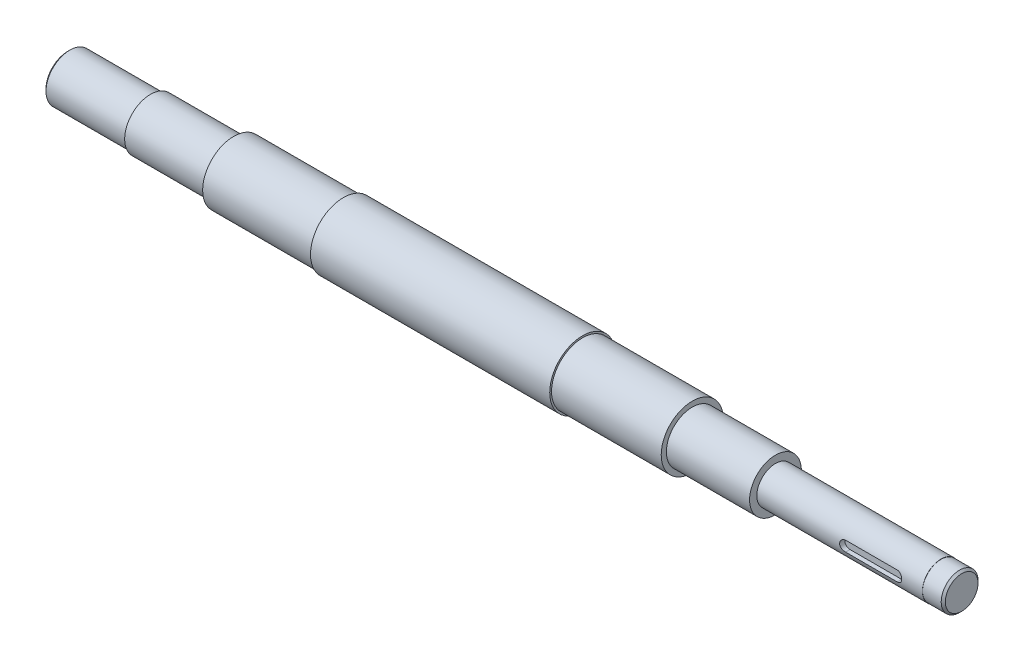
ISO-10303-21;
HEADER;
FILE_DESCRIPTION(('STEP AP214'),'2;1');
FILE_NAME('part.step','',(''),(''),'','','');
FILE_SCHEMA(('AUTOMOTIVE_DESIGN { 1 0 10303 214 1 1 1 1 }'));
ENDSEC;
DATA;
#1=APPLICATION_CONTEXT('core data for automotive mechanical design processes');
#2=APPLICATION_PROTOCOL_DEFINITION('international standard','automotive_design',2000,#1);
#3=PRODUCT_CONTEXT('',#1,'mechanical');
#4=PRODUCT('Part','Part','',(#3));
#5=PRODUCT_RELATED_PRODUCT_CATEGORY('part','',(#4));
#6=PRODUCT_DEFINITION_FORMATION('','',#4);
#7=PRODUCT_DEFINITION_CONTEXT('part definition',#1,'design');
#8=PRODUCT_DEFINITION('design','',#6,#7);
#9=PRODUCT_DEFINITION_SHAPE('','',#8);
#10=(LENGTH_UNIT() NAMED_UNIT(*) SI_UNIT(.MILLI.,.METRE.));
#11=(NAMED_UNIT(*) PLANE_ANGLE_UNIT() SI_UNIT($,.RADIAN.));
#12=(NAMED_UNIT(*) SI_UNIT($,.STERADIAN.) SOLID_ANGLE_UNIT());
#13=UNCERTAINTY_MEASURE_WITH_UNIT(LENGTH_MEASURE(1.E-05),#10,'distance_accuracy_value','');
#14=(GEOMETRIC_REPRESENTATION_CONTEXT(3) GLOBAL_UNCERTAINTY_ASSIGNED_CONTEXT((#13)) GLOBAL_UNIT_ASSIGNED_CONTEXT((#10,
#11,#12)) REPRESENTATION_CONTEXT('',''));
#15=CARTESIAN_POINT('',(0.,0.,0.));
#16=DIRECTION('',(0.,0.,1.));
#17=DIRECTION('',(1.,0.,0.));
#18=AXIS2_PLACEMENT_3D('',#15,#16,#17);
#19=CARTESIAN_POINT('',(110.8,15.,0.));
#20=DIRECTION('',(-1.,0.,0.));
#21=DIRECTION('',(0.,0.,1.));
#22=AXIS2_PLACEMENT_3D('',#19,#20,#21);
#23=PLANE('',#22);
#24=CARTESIAN_POINT('',(110.8,0.,0.));
#25=DIRECTION('',(-1.,0.,0.));
#26=DIRECTION('',(0.,0.,1.));
#27=AXIS2_PLACEMENT_3D('',#24,#25,#26);
#28=CIRCLE('',#27,15.);
#29=CARTESIAN_POINT('',(110.8,0.,15.));
#30=VERTEX_POINT('',#29);
#31=EDGE_CURVE('E158',#30,#30,#28,.T.);
#32=ORIENTED_EDGE('',*,*,#31,.F.);
#33=EDGE_LOOP('',(#32));
#34=FACE_BOUND('',#33,.T.);
#35=CARTESIAN_POINT('',(110.8,0.,0.));
#36=DIRECTION('',(-1.,0.,0.));
#37=DIRECTION('',(0.,0.,1.));
#38=AXIS2_PLACEMENT_3D('',#35,#36,#37);
#39=CIRCLE('',#38,12.5);
#40=CARTESIAN_POINT('',(110.8,0.,12.5));
#41=VERTEX_POINT('',#40);
#42=EDGE_CURVE('E104',#41,#41,#39,.T.);
#43=ORIENTED_EDGE('',*,*,#42,.T.);
#44=EDGE_LOOP('',(#43));
#45=FACE_BOUND('',#44,.T.);
#46=ADVANCED_FACE('F39',(#34,#45),#23,.F.);
#47=CARTESIAN_POINT('',(0.,0.,0.));
#48=DIRECTION('',(-1.,0.,0.));
#49=DIRECTION('',(0.,0.,1.));
#50=AXIS2_PLACEMENT_3D('',#47,#48,#49);
#51=CYLINDRICAL_SURFACE('',#50,15.);
#52=CARTESIAN_POINT('',(57.8,0.,0.));
#53=DIRECTION('',(-1.,0.,0.));
#54=DIRECTION('',(0.,0.,1.));
#55=AXIS2_PLACEMENT_3D('',#52,#53,#54);
#56=CIRCLE('',#55,15.);
#57=CARTESIAN_POINT('',(57.8,0.,15.));
#58=VERTEX_POINT('',#57);
#59=EDGE_CURVE('E155',#58,#58,#56,.T.);
#60=ORIENTED_EDGE('',*,*,#59,.F.);
#61=EDGE_LOOP('',(#60));
#62=FACE_BOUND('',#61,.T.);
#63=ORIENTED_EDGE('',*,*,#31,.T.);
#64=EDGE_LOOP('',(#63));
#65=FACE_BOUND('',#64,.T.);
#66=ADVANCED_FACE('F206',(#62,#65),#51,.T.);
#67=CARTESIAN_POINT('',(57.8,15.875,0.));
#68=DIRECTION('',(-1.,0.,0.));
#69=DIRECTION('',(0.,0.,1.));
#70=AXIS2_PLACEMENT_3D('',#67,#68,#69);
#71=PLANE('',#70);
#72=CARTESIAN_POINT('',(57.8,0.,0.));
#73=DIRECTION('',(-1.,0.,0.));
#74=DIRECTION('',(0.,0.,1.));
#75=AXIS2_PLACEMENT_3D('',#72,#73,#74);
#76=CIRCLE('',#75,15.875);
#77=CARTESIAN_POINT('',(57.8,0.,15.875));
#78=VERTEX_POINT('',#77);
#79=EDGE_CURVE('E152',#78,#78,#76,.T.);
#80=ORIENTED_EDGE('',*,*,#79,.F.);
#81=EDGE_LOOP('',(#80));
#82=FACE_BOUND('',#81,.T.);
#83=ORIENTED_EDGE('',*,*,#59,.T.);
#84=EDGE_LOOP('',(#83));
#85=FACE_BOUND('',#84,.T.);
#86=ADVANCED_FACE('F211',(#82,#85),#71,.F.);
#87=CARTESIAN_POINT('',(0.,0.,0.));
#88=DIRECTION('',(-1.,0.,0.));
#89=DIRECTION('',(0.,0.,1.));
#90=AXIS2_PLACEMENT_3D('',#87,#88,#89);
#91=CYLINDRICAL_SURFACE('',#90,15.875);
#92=CARTESIAN_POINT('',(-57.8,0.,0.));
#93=DIRECTION('',(-1.,0.,0.));
#94=DIRECTION('',(0.,0.,1.));
#95=AXIS2_PLACEMENT_3D('',#92,#93,#94);
#96=CIRCLE('',#95,15.875);
#97=CARTESIAN_POINT('',(-57.8,0.,15.875));
#98=VERTEX_POINT('',#97);
#99=EDGE_CURVE('E149',#98,#98,#96,.T.);
#100=ORIENTED_EDGE('',*,*,#99,.F.);
#101=EDGE_LOOP('',(#100));
#102=FACE_BOUND('',#101,.T.);
#103=ORIENTED_EDGE('',*,*,#79,.T.);
#104=EDGE_LOOP('',(#103));
#105=FACE_BOUND('',#104,.T.);
#106=ADVANCED_FACE('F221',(#102,#105),#91,.T.);
#107=CARTESIAN_POINT('',(-57.8,15.875,0.));
#108=DIRECTION('',(1.,0.,0.));
#109=DIRECTION('',(0.,0.,-1.));
#110=AXIS2_PLACEMENT_3D('',#107,#108,#109);
#111=PLANE('',#110);
#112=CARTESIAN_POINT('',(-57.8,0.,0.));
#113=DIRECTION('',(-1.,0.,0.));
#114=DIRECTION('',(0.,0.,1.));
#115=AXIS2_PLACEMENT_3D('',#112,#113,#114);
#116=CIRCLE('',#115,15.);
#117=CARTESIAN_POINT('',(-57.8,0.,15.));
#118=VERTEX_POINT('',#117);
#119=EDGE_CURVE('E146',#118,#118,#116,.T.);
#120=ORIENTED_EDGE('',*,*,#119,.F.);
#121=EDGE_LOOP('',(#120));
#122=FACE_BOUND('',#121,.T.);
#123=ORIENTED_EDGE('',*,*,#99,.T.);
#124=EDGE_LOOP('',(#123));
#125=FACE_BOUND('',#124,.T.);
#126=ADVANCED_FACE('F228',(#122,#125),#111,.F.);
#127=CARTESIAN_POINT('',(0.,0.,0.));
#128=DIRECTION('',(-1.,0.,0.));
#129=DIRECTION('',(0.,0.,1.));
#130=AXIS2_PLACEMENT_3D('',#127,#128,#129);
#131=CYLINDRICAL_SURFACE('',#130,15.);
#132=CARTESIAN_POINT('',(-110.8,0.,0.));
#133=DIRECTION('',(-1.,0.,0.));
#134=DIRECTION('',(0.,0.,1.));
#135=AXIS2_PLACEMENT_3D('',#132,#133,#134);
#136=CIRCLE('',#135,15.);
#137=CARTESIAN_POINT('',(-110.8,0.,15.));
#138=VERTEX_POINT('',#137);
#139=EDGE_CURVE('E143',#138,#138,#136,.T.);
#140=ORIENTED_EDGE('',*,*,#139,.F.);
#141=EDGE_LOOP('',(#140));
#142=FACE_BOUND('',#141,.T.);
#143=ORIENTED_EDGE('',*,*,#119,.T.);
#144=EDGE_LOOP('',(#143));
#145=FACE_BOUND('',#144,.T.);
#146=ADVANCED_FACE('F232',(#142,#145),#131,.T.);
#147=CARTESIAN_POINT('',(-110.8,15.,0.));
#148=DIRECTION('',(1.,0.,0.));
#149=DIRECTION('',(0.,0.,-1.));
#150=AXIS2_PLACEMENT_3D('',#147,#148,#149);
#151=PLANE('',#150);
#152=CARTESIAN_POINT('',(-110.8,0.,0.));
#153=DIRECTION('',(-1.,0.,0.));
#154=DIRECTION('',(0.,0.,1.));
#155=AXIS2_PLACEMENT_3D('',#152,#153,#154);
#156=CIRCLE('',#155,12.5);
#157=CARTESIAN_POINT('',(-110.8,0.,12.5));
#158=VERTEX_POINT('',#157);
#159=EDGE_CURVE('E140',#158,#158,#156,.T.);
#160=ORIENTED_EDGE('',*,*,#159,.F.);
#161=EDGE_LOOP('',(#160));
#162=FACE_BOUND('',#161,.T.);
#163=ORIENTED_EDGE('',*,*,#139,.T.);
#164=EDGE_LOOP('',(#163));
#165=FACE_BOUND('',#164,.T.);
#166=ADVANCED_FACE('F236',(#162,#165),#151,.F.);
#167=CARTESIAN_POINT('',(0.,0.,0.));
#168=DIRECTION('',(-1.,0.,0.));
#169=DIRECTION('',(0.,0.,1.));
#170=AXIS2_PLACEMENT_3D('',#167,#168,#169);
#171=CYLINDRICAL_SURFACE('',#170,12.5);
#172=CARTESIAN_POINT('',(-151.,0.,0.));
#173=DIRECTION('',(-1.,0.,0.));
#174=DIRECTION('',(0.,0.,1.));
#175=AXIS2_PLACEMENT_3D('',#172,#173,#174);
#176=CIRCLE('',#175,12.5);
#177=CARTESIAN_POINT('',(-151.,0.,12.5));
#178=VERTEX_POINT('',#177);
#179=EDGE_CURVE('E137',#178,#178,#176,.T.);
#180=ORIENTED_EDGE('',*,*,#179,.F.);
#181=EDGE_LOOP('',(#180));
#182=FACE_BOUND('',#181,.T.);
#183=ORIENTED_EDGE('',*,*,#159,.T.);
#184=EDGE_LOOP('',(#183));
#185=FACE_BOUND('',#184,.T.);
#186=ADVANCED_FACE('F240',(#182,#185),#171,.T.);
#187=CARTESIAN_POINT('',(-151.,12.5,0.));
#188=DIRECTION('',(1.,0.,0.));
#189=DIRECTION('',(0.,0.,-1.));
#190=AXIS2_PLACEMENT_3D('',#187,#188,#189);
#191=PLANE('',#190);
#192=CARTESIAN_POINT('',(-151.,0.,0.));
#193=DIRECTION('',(-1.,0.,0.));
#194=DIRECTION('',(0.,0.,1.));
#195=AXIS2_PLACEMENT_3D('',#192,#193,#194);
#196=CIRCLE('',#195,11.5);
#197=CARTESIAN_POINT('',(-151.,0.,11.5));
#198=VERTEX_POINT('',#197);
#199=EDGE_CURVE('E134',#198,#198,#196,.T.);
#200=ORIENTED_EDGE('',*,*,#199,.F.);
#201=EDGE_LOOP('',(#200));
#202=FACE_BOUND('',#201,.T.);
#203=ORIENTED_EDGE('',*,*,#179,.T.);
#204=EDGE_LOOP('',(#203));
#205=FACE_BOUND('',#204,.T.);
#206=ADVANCED_FACE('F244',(#202,#205),#191,.F.);
#207=CARTESIAN_POINT('',(0.,0.,0.));
#208=DIRECTION('',(-1.,0.,0.));
#209=DIRECTION('',(0.,0.,1.));
#210=AXIS2_PLACEMENT_3D('',#207,#208,#209);
#211=CYLINDRICAL_SURFACE('',#210,11.5);
#212=CARTESIAN_POINT('',(-190.,0.,0.));
#213=DIRECTION('',(-1.,0.,0.));
#214=DIRECTION('',(0.,0.,1.));
#215=AXIS2_PLACEMENT_3D('',#212,#213,#214);
#216=CIRCLE('',#215,11.5);
#217=CARTESIAN_POINT('',(-190.,0.,11.5));
#218=VERTEX_POINT('',#217);
#219=EDGE_CURVE('E131',#218,#218,#216,.T.);
#220=ORIENTED_EDGE('',*,*,#219,.F.);
#221=EDGE_LOOP('',(#220));
#222=FACE_BOUND('',#221,.T.);
#223=ORIENTED_EDGE('',*,*,#199,.T.);
#224=EDGE_LOOP('',(#223));
#225=FACE_BOUND('',#224,.T.);
#226=ADVANCED_FACE('F248',(#222,#225),#211,.T.);
#227=CARTESIAN_POINT('',(-190.,0.,0.));
#228=DIRECTION('',(1.,0.,0.));
#229=DIRECTION('',(0.,0.,-1.));
#230=AXIS2_PLACEMENT_3D('',#227,#228,#229);
#231=CONICAL_SURFACE('',#230,11.5,0.785398163397448);
#232=CARTESIAN_POINT('',(-191.,0.,0.));
#233=DIRECTION('',(-1.,0.,0.));
#234=DIRECTION('',(0.,0.,1.));
#235=AXIS2_PLACEMENT_3D('',#232,#233,#234);
#236=CIRCLE('',#235,10.5);
#237=CARTESIAN_POINT('',(-191.,0.,10.5));
#238=VERTEX_POINT('',#237);
#239=EDGE_CURVE('E128',#238,#238,#236,.T.);
#240=ORIENTED_EDGE('',*,*,#239,.F.);
#241=EDGE_LOOP('',(#240));
#242=FACE_BOUND('',#241,.T.);
#243=ORIENTED_EDGE('',*,*,#219,.T.);
#244=EDGE_LOOP('',(#243));
#245=FACE_BOUND('',#244,.T.);
#246=ADVANCED_FACE('F252',(#242,#245),#231,.T.);
#247=CARTESIAN_POINT('',(-191.,10.5,0.));
#248=DIRECTION('',(1.,0.,0.));
#249=DIRECTION('',(0.,0.,-1.));
#250=AXIS2_PLACEMENT_3D('',#247,#248,#249);
#251=PLANE('',#250);
#252=ORIENTED_EDGE('',*,*,#239,.T.);
#253=EDGE_LOOP('',(#252));
#254=FACE_BOUND('',#253,.T.);
#255=ADVANCED_FACE('F256',(#254),#251,.F.);
#256=CARTESIAN_POINT('',(241.,7.9,0.));
#257=DIRECTION('',(-1.,0.,0.));
#258=DIRECTION('',(0.,0.,1.));
#259=AXIS2_PLACEMENT_3D('',#256,#257,#258);
#260=PLANE('',#259);
#261=CARTESIAN_POINT('',(241.,0.,0.));
#262=DIRECTION('',(-1.,0.,0.));
#263=DIRECTION('',(0.,0.,1.));
#264=AXIS2_PLACEMENT_3D('',#261,#262,#263);
#265=CIRCLE('',#264,7.9);
#266=CARTESIAN_POINT('',(241.,0.,7.9));
#267=VERTEX_POINT('',#266);
#268=EDGE_CURVE('E125',#267,#267,#265,.T.);
#269=ORIENTED_EDGE('',*,*,#268,.F.);
#270=EDGE_LOOP('',(#269));
#271=FACE_BOUND('',#270,.T.);
#272=ADVANCED_FACE('F260',(#271),#260,.F.);
#273=CARTESIAN_POINT('',(241.,0.,0.));
#274=DIRECTION('',(-1.,0.,0.));
#275=DIRECTION('',(0.,0.,1.));
#276=AXIS2_PLACEMENT_3D('',#273,#274,#275);
#277=CONICAL_SURFACE('',#276,7.9,0.785398163397461);
#278=CARTESIAN_POINT('',(240.,0.,0.));
#279=DIRECTION('',(-1.,0.,0.));
#280=DIRECTION('',(0.,0.,1.));
#281=AXIS2_PLACEMENT_3D('',#278,#279,#280);
#282=CIRCLE('',#281,8.9);
#283=CARTESIAN_POINT('',(240.,0.,8.9));
#284=VERTEX_POINT('',#283);
#285=EDGE_CURVE('E122',#284,#284,#282,.T.);
#286=ORIENTED_EDGE('',*,*,#285,.F.);
#287=EDGE_LOOP('',(#286));
#288=FACE_BOUND('',#287,.T.);
#289=ORIENTED_EDGE('',*,*,#268,.T.);
#290=EDGE_LOOP('',(#289));
#291=FACE_BOUND('',#290,.T.);
#292=ADVANCED_FACE('F264',(#288,#291),#277,.T.);
#293=CARTESIAN_POINT('',(0.,0.,0.));
#294=DIRECTION('',(-1.,0.,0.));
#295=DIRECTION('',(0.,0.,1.));
#296=AXIS2_PLACEMENT_3D('',#293,#294,#295);
#297=CYLINDRICAL_SURFACE('',#296,8.9);
#298=CARTESIAN_POINT('',(231.,0.,0.));
#299=DIRECTION('',(-1.,0.,0.));
#300=DIRECTION('',(0.,0.,1.));
#301=AXIS2_PLACEMENT_3D('',#298,#299,#300);
#302=CIRCLE('',#301,8.9);
#303=CARTESIAN_POINT('',(231.,0.,8.9));
#304=VERTEX_POINT('',#303);
#305=EDGE_CURVE('E119',#304,#304,#302,.T.);
#306=ORIENTED_EDGE('',*,*,#305,.F.);
#307=EDGE_LOOP('',(#306));
#308=FACE_BOUND('',#307,.T.);
#309=ORIENTED_EDGE('',*,*,#285,.T.);
#310=EDGE_LOOP('',(#309));
#311=FACE_BOUND('',#310,.T.);
#312=ADVANCED_FACE('F268',(#308,#311),#297,.T.);
#313=CARTESIAN_POINT('',(231.,9.,0.));
#314=DIRECTION('',(-1.,0.,0.));
#315=DIRECTION('',(0.,0.,1.));
#316=AXIS2_PLACEMENT_3D('',#313,#314,#315);
#317=PLANE('',#316);
#318=CARTESIAN_POINT('',(231.,0.,0.));
#319=DIRECTION('',(-1.,0.,0.));
#320=DIRECTION('',(0.,0.,1.));
#321=AXIS2_PLACEMENT_3D('',#318,#319,#320);
#322=CIRCLE('',#321,9.);
#323=CARTESIAN_POINT('',(231.,0.,9.));
#324=VERTEX_POINT('',#323);
#325=EDGE_CURVE('E116',#324,#324,#322,.T.);
#326=ORIENTED_EDGE('',*,*,#325,.F.);
#327=EDGE_LOOP('',(#326));
#328=FACE_BOUND('',#327,.T.);
#329=ORIENTED_EDGE('',*,*,#305,.T.);
#330=EDGE_LOOP('',(#329));
#331=FACE_BOUND('',#330,.T.);
#332=ADVANCED_FACE('F201',(#328,#331),#317,.F.);
#333=CARTESIAN_POINT('',(0.,0.,0.));
#334=DIRECTION('',(-1.,0.,0.));
#335=DIRECTION('',(0.,0.,1.));
#336=AXIS2_PLACEMENT_3D('',#333,#334,#335);
#337=CYLINDRICAL_SURFACE('',#336,9.);
#338=DIRECTION('',(-1.,0.,0.));
#339=VECTOR('',#338,1.);
#340=CARTESIAN_POINT('',(0.,2.5,8.64580823289529));
#341=LINE('',#340,#339);
#342=CARTESIAN_POINT('',(193.5,2.5,8.64580823289529));
#343=VERTEX_POINT('',#342);
#344=CARTESIAN_POINT('',(218.5,2.5,8.64580823289529));
#345=VERTEX_POINT('',#344);
#346=EDGE_CURVE('E11',#343,#345,#341,.F.);
#347=ORIENTED_EDGE('',*,*,#346,.T.);
#348=CARTESIAN_POINT('',(218.5,2.5,8.64580823289529));
#349=CARTESIAN_POINT('',(218.568858519984,2.50000830602292,8.64579950821757));
#350=CARTESIAN_POINT('',(218.637711900234,2.49715524603601,8.64663065807681));
#351=CARTESIAN_POINT('',(218.774898182384,2.48579096319931,8.64990792871954));
#352=CARTESIAN_POINT('',(218.84323118469,2.4772808613535,8.65235372954183));
#353=CARTESIAN_POINT('',(218.9787401302,2.45469269677159,8.6587882563543));
#354=CARTESIAN_POINT('',(219.045918348812,2.44062732375281,8.66277346547357));
#355=CARTESIAN_POINT('',(219.178784214456,2.40706322245486,8.67215936886944));
#356=CARTESIAN_POINT('',(219.244471831231,2.38756438399058,8.6775600918511));
#357=CARTESIAN_POINT('',(219.4385854376,2.3211450863276,8.69565518457923));
#358=CARTESIAN_POINT('',(219.564217461871,2.26627569938269,8.71025040337274));
#359=CARTESIAN_POINT('',(219.804480821549,2.13704900713882,8.7428505104496));
#360=CARTESIAN_POINT('',(219.919108023139,2.06268441755019,8.76085667251656));
#361=CARTESIAN_POINT('',(220.137253062746,1.89441897395303,8.79879412854936));
#362=CARTESIAN_POINT('',(220.240432067064,1.80008616533363,8.81876164554148));
#363=CARTESIAN_POINT('',(220.429727835009,1.59548835100875,8.85806142034494));
#364=CARTESIAN_POINT('',(220.515841795427,1.48522073288933,8.87739357335314));
#365=CARTESIAN_POINT('',(220.670005812165,1.24949780504097,8.91365243290547));
#366=CARTESIAN_POINT('',(220.737713578881,1.12381058827196,8.93053115307204));
#367=CARTESIAN_POINT('',(220.850901478086,0.862294107712359,8.95956074597986));
#368=CARTESIAN_POINT('',(220.896386705027,0.726467176659795,8.9717127021874));
#369=CARTESIAN_POINT('',(220.962730562329,0.45208782656323,8.98966308671867));
#370=CARTESIAN_POINT('',(220.984170575248,0.313685954719484,8.99561125337261));
#371=CARTESIAN_POINT('',(221.003647504672,0.0351274681096658,9.00100868484384));
#372=CARTESIAN_POINT('',(221.001688157166,-0.105028862966283,9.00045898712353));
#373=CARTESIAN_POINT('',(220.974824381365,-0.379054928934831,8.99303084531464));
#374=CARTESIAN_POINT('',(220.950548998979,-0.512991760209238,8.98632591253905));
#375=CARTESIAN_POINT('',(220.880762395271,-0.774808772562597,8.96754747987061));
#376=CARTESIAN_POINT('',(220.835250127526,-0.902688654850778,8.95547371543655));
#377=CARTESIAN_POINT('',(220.72381745397,-1.1503346990943,8.92706237810073));
#378=CARTESIAN_POINT('',(220.657687037923,-1.27000115579179,8.91068121327166));
#379=CARTESIAN_POINT('',(220.507058742606,-1.4967464992131,8.87541187730876));
#380=CARTESIAN_POINT('',(220.422557350944,-1.60382297278663,8.85652322703191));
#381=CARTESIAN_POINT('',(220.234281783126,-1.80609604775248,8.81753868463739));
#382=CARTESIAN_POINT('',(220.129961776031,-1.90078144217946,8.79742352895559));
#383=CARTESIAN_POINT('',(219.90669026155,-2.07146532777182,8.75880771863633));
#384=CARTESIAN_POINT('',(219.787734668071,-2.14745858245887,8.74030751735181));
#385=CARTESIAN_POINT('',(219.53736408609,-2.279043092931,8.70692961253113));
#386=CARTESIAN_POINT('',(219.405860159451,-2.33447263872621,8.69208091884035));
#387=CARTESIAN_POINT('',(219.134955984888,-2.42219486985499,8.66804909513355));
#388=CARTESIAN_POINT('',(218.995568001034,-2.45452247840333,8.65885741633596));
#389=CARTESIAN_POINT('',(218.795766236119,-2.48315519772344,8.65066448386834));
#390=CARTESIAN_POINT('',(218.73675823361,-2.4894721783985,8.64884681865799));
#391=CARTESIAN_POINT('',(218.618509832525,-2.49789031419067,8.64641887399253));
#392=CARTESIAN_POINT('',(218.559269937782,-2.49999800738002,8.6458067220955));
#393=CARTESIAN_POINT('',(218.5,-2.5,8.64580823289529));
#394=B_SPLINE_CURVE_WITH_KNOTS('',3,(#348,#349,#350,#351,#352,#353,#354,#355,#356,#357,#358,
#359,#360,#361,#362,#363,#364,#365,#366,#367,#368,#369,#370,#371,#372,#373,#374,#375,#376,#377,
#378,#379,#380,#381,#382,#383,#384,#385,#386,#387,#388,#389,#390,#391,#392,#393),.UNSPECIFIED.,
.F.,.F.,(4,2,2,2,2,2,2,2,2,2,2,2,2,2,2,2,2,2,2,2,2,2,4),(0.,0.206502660795462,0.412964413050601,
0.618957254291912,0.82495427316108,1.23648126604289,1.64816224372854,2.06987642360531,
2.49165981952705,2.92082040021563,3.34988255089614,3.76833045963874,4.18671155902951,
4.59364934888088,5.00060719220965,5.41185362819261,5.82317876064755,6.24813326230633,
6.67320667689381,7.10155530371388,7.5292550179011,7.70724135419259,7.88495101767144),.UNSPECIFIED.);
#395=CARTESIAN_POINT('',(218.5,-2.5,8.64580823289529));
#396=VERTEX_POINT('',#395);
#397=EDGE_CURVE('E161',#345,#396,#394,.T.);
#398=ORIENTED_EDGE('',*,*,#397,.T.);
#399=DIRECTION('',(-1.,0.,0.));
#400=VECTOR('',#399,1.);
#401=CARTESIAN_POINT('',(0.,-2.5,8.64580823289529));
#402=LINE('',#401,#400);
#403=CARTESIAN_POINT('',(193.5,-2.5,8.64580823289529));
#404=VERTEX_POINT('',#403);
#405=EDGE_CURVE('E46',#396,#404,#402,.T.);
#406=ORIENTED_EDGE('',*,*,#405,.T.);
#407=CARTESIAN_POINT('',(193.5,-2.5,8.64580823289529));
#408=CARTESIAN_POINT('',(193.431141480016,-2.50000830602292,8.64579950821757));
#409=CARTESIAN_POINT('',(193.362288099766,-2.49715524603601,8.64663065807681));
#410=CARTESIAN_POINT('',(193.225101817615,-2.48579096319931,8.64990792871954));
#411=CARTESIAN_POINT('',(193.15676881531,-2.47728086135349,8.65235372954183));
#412=CARTESIAN_POINT('',(193.0212598698,-2.45469269677159,8.6587882563543));
#413=CARTESIAN_POINT('',(192.954081651188,-2.44062732375281,8.66277346547357));
#414=CARTESIAN_POINT('',(192.821215785544,-2.40706322245486,8.67215936886944));
#415=CARTESIAN_POINT('',(192.755528168768,-2.38756438399058,8.6775600918511));
#416=CARTESIAN_POINT('',(192.5614145624,-2.3211450863276,8.69565518457923));
#417=CARTESIAN_POINT('',(192.435782538129,-2.26627569938269,8.71025040337274));
#418=CARTESIAN_POINT('',(192.19551917845,-2.13704900713882,8.7428505104496));
#419=CARTESIAN_POINT('',(192.080891976861,-2.06268441755019,8.76085667251656));
#420=CARTESIAN_POINT('',(191.862746937254,-1.89441897395303,8.79879412854936));
#421=CARTESIAN_POINT('',(191.759567932935,-1.80008616533363,8.81876164554148));
#422=CARTESIAN_POINT('',(191.570272164991,-1.59548835100875,8.85806142034494));
#423=CARTESIAN_POINT('',(191.484158204573,-1.48522073288933,8.87739357335314));
#424=CARTESIAN_POINT('',(191.329994187835,-1.24949780504097,8.91365243290547));
#425=CARTESIAN_POINT('',(191.262286421119,-1.12381058827196,8.93053115307204));
#426=CARTESIAN_POINT('',(191.149098521914,-0.862294107712359,8.95956074597986));
#427=CARTESIAN_POINT('',(191.103613294973,-0.726467176659795,8.9717127021874));
#428=CARTESIAN_POINT('',(191.03726943767,-0.45208782656323,8.98966308671867));
#429=CARTESIAN_POINT('',(191.015829424752,-0.313685954719484,8.99561125337261));
#430=CARTESIAN_POINT('',(190.996352495328,-0.0351274681096658,9.00100868484384));
#431=CARTESIAN_POINT('',(190.998311842833,0.105028862966283,9.00045898712353));
#432=CARTESIAN_POINT('',(191.025175618635,0.379054928934831,8.99303084531464));
#433=CARTESIAN_POINT('',(191.04945100102,0.512991760209238,8.98632591253905));
#434=CARTESIAN_POINT('',(191.119237604729,0.774808772562597,8.96754747987061));
#435=CARTESIAN_POINT('',(191.164749872474,0.902688654850778,8.95547371543655));
#436=CARTESIAN_POINT('',(191.276182546029,1.1503346990943,8.92706237810073));
#437=CARTESIAN_POINT('',(191.342312962076,1.27000115579179,8.91068121327166));
#438=CARTESIAN_POINT('',(191.492941257394,1.4967464992131,8.87541187730876));
#439=CARTESIAN_POINT('',(191.577442649056,1.60382297278663,8.85652322703191));
#440=CARTESIAN_POINT('',(191.765718216874,1.80609604775248,8.81753868463739));
#441=CARTESIAN_POINT('',(191.870038223969,1.90078144217946,8.79742352895559));
#442=CARTESIAN_POINT('',(192.09330973845,2.07146532777182,8.75880771863633));
#443=CARTESIAN_POINT('',(192.212265331929,2.14745858245887,8.74030751735181));
#444=CARTESIAN_POINT('',(192.462635913909,2.279043092931,8.70692961253113));
#445=CARTESIAN_POINT('',(192.594139840549,2.33447263872621,8.69208091884035));
#446=CARTESIAN_POINT('',(192.865044015112,2.422194869855,8.66804909513355));
#447=CARTESIAN_POINT('',(193.004431998966,2.45452247840334,8.65885741633596));
#448=CARTESIAN_POINT('',(193.204233763881,2.48315519772344,8.65066448386834));
#449=CARTESIAN_POINT('',(193.263241766389,2.4894721783985,8.64884681865799));
#450=CARTESIAN_POINT('',(193.381490167475,2.49789031419067,8.64641887399253));
#451=CARTESIAN_POINT('',(193.440730062218,2.49999800738002,8.6458067220955));
#452=CARTESIAN_POINT('',(193.5,2.5,8.64580823289529));
#453=B_SPLINE_CURVE_WITH_KNOTS('',3,(#407,#408,#409,#410,#411,#412,#413,#414,#415,#416,#417,
#418,#419,#420,#421,#422,#423,#424,#425,#426,#427,#428,#429,#430,#431,#432,#433,#434,#435,#436,
#437,#438,#439,#440,#441,#442,#443,#444,#445,#446,#447,#448,#449,#450,#451,#452),.UNSPECIFIED.,
.F.,.F.,(4,2,2,2,2,2,2,2,2,2,2,2,2,2,2,2,2,2,2,2,2,2,4),(0.,0.20650266079549,0.412964413050601,
0.618957254291912,0.82495427316108,1.23648126604289,1.64816224372854,2.06987642360531,
2.49165981952705,2.92082040021563,3.34988255089614,3.76833045963874,4.18671155902951,
4.59364934888088,5.00060719220965,5.41185362819261,5.82317876064755,6.24813326230633,
6.67320667689381,7.10155530371391,7.5292550179011,7.70724135419259,7.88495101767144),.UNSPECIFIED.);
#454=EDGE_CURVE('E53',#404,#343,#453,.T.);
#455=ORIENTED_EDGE('',*,*,#454,.T.);
#456=EDGE_LOOP('',(#347,#398,#406,#455));
#457=FACE_BOUND('',#456,.T.);
#458=CARTESIAN_POINT('',(151.,0.,0.));
#459=DIRECTION('',(-1.,0.,0.));
#460=DIRECTION('',(0.,0.,1.));
#461=AXIS2_PLACEMENT_3D('',#458,#459,#460);
#462=CIRCLE('',#461,9.);
#463=CARTESIAN_POINT('',(151.,0.,9.));
#464=VERTEX_POINT('',#463);
#465=EDGE_CURVE('E113',#464,#464,#462,.T.);
#466=ORIENTED_EDGE('',*,*,#465,.F.);
#467=EDGE_LOOP('',(#466));
#468=FACE_BOUND('',#467,.T.);
#469=ORIENTED_EDGE('',*,*,#325,.T.);
#470=EDGE_LOOP('',(#469));
#471=FACE_BOUND('',#470,.T.);
#472=ADVANCED_FACE('F175',(#457,#468,#471),#337,.T.);
#473=CARTESIAN_POINT('',(151.,12.5,0.));
#474=DIRECTION('',(-1.,0.,0.));
#475=DIRECTION('',(0.,0.,1.));
#476=AXIS2_PLACEMENT_3D('',#473,#474,#475);
#477=PLANE('',#476);
#478=CARTESIAN_POINT('',(151.,0.,0.));
#479=DIRECTION('',(-1.,0.,0.));
#480=DIRECTION('',(0.,0.,1.));
#481=AXIS2_PLACEMENT_3D('',#478,#479,#480);
#482=CIRCLE('',#481,12.5);
#483=CARTESIAN_POINT('',(151.,0.,12.5));
#484=VERTEX_POINT('',#483);
#485=EDGE_CURVE('E110',#484,#484,#482,.T.);
#486=ORIENTED_EDGE('',*,*,#485,.F.);
#487=EDGE_LOOP('',(#486));
#488=FACE_BOUND('',#487,.T.);
#489=ORIENTED_EDGE('',*,*,#465,.T.);
#490=EDGE_LOOP('',(#489));
#491=FACE_BOUND('',#490,.T.);
#492=ADVANCED_FACE('F193',(#488,#491),#477,.F.);
#493=CARTESIAN_POINT('',(0.,0.,0.));
#494=DIRECTION('',(-1.,0.,0.));
#495=DIRECTION('',(0.,0.,1.));
#496=AXIS2_PLACEMENT_3D('',#493,#494,#495);
#497=CYLINDRICAL_SURFACE('',#496,12.5);
#498=ORIENTED_EDGE('',*,*,#42,.F.);
#499=EDGE_LOOP('',(#498));
#500=FACE_BOUND('',#499,.T.);
#501=ORIENTED_EDGE('',*,*,#485,.T.);
#502=EDGE_LOOP('',(#501));
#503=FACE_BOUND('',#502,.T.);
#504=ADVANCED_FACE('F191',(#500,#503),#497,.T.);
#505=CARTESIAN_POINT('',(193.5,0.,6.5));
#506=DIRECTION('',(0.,0.,1.));
#507=DIRECTION('',(1.,0.,0.));
#508=AXIS2_PLACEMENT_3D('',#505,#506,#507);
#509=CYLINDRICAL_SURFACE('',#508,2.5);
#510=DIRECTION('',(0.,0.,1.));
#511=VECTOR('',#510,1.);
#512=CARTESIAN_POINT('',(193.5,-2.5,6.5));
#513=LINE('',#512,#511);
#514=CARTESIAN_POINT('',(193.5,-2.5,6.5));
#515=VERTEX_POINT('',#514);
#516=EDGE_CURVE('E76',#515,#404,#513,.T.);
#517=ORIENTED_EDGE('',*,*,#516,.F.);
#518=CARTESIAN_POINT('',(193.5,0.,6.5));
#519=DIRECTION('',(0.,0.,1.));
#520=DIRECTION('',(1.,0.,0.));
#521=AXIS2_PLACEMENT_3D('',#518,#519,#520);
#522=CIRCLE('',#521,2.5);
#523=CARTESIAN_POINT('',(193.5,2.5,6.5));
#524=VERTEX_POINT('',#523);
#525=EDGE_CURVE('E80',#524,#515,#522,.T.);
#526=ORIENTED_EDGE('',*,*,#525,.F.);
#527=DIRECTION('',(0.,0.,1.));
#528=VECTOR('',#527,1.);
#529=CARTESIAN_POINT('',(193.5,2.5,6.5));
#530=LINE('',#529,#528);
#531=EDGE_CURVE('E102',#524,#343,#530,.T.);
#532=ORIENTED_EDGE('',*,*,#531,.T.);
#533=ORIENTED_EDGE('',*,*,#454,.F.);
#534=EDGE_LOOP('',(#517,#526,#532,#533));
#535=FACE_BOUND('',#534,.T.);
#536=ADVANCED_FACE('F78',(#535),#509,.F.);
#537=CARTESIAN_POINT('',(193.5,2.5,6.5));
#538=DIRECTION('',(0.,1.,0.));
#539=DIRECTION('',(0.,0.,1.));
#540=AXIS2_PLACEMENT_3D('',#537,#538,#539);
#541=PLANE('',#540);
#542=ORIENTED_EDGE('',*,*,#531,.F.);
#543=DIRECTION('',(-1.,0.,0.));
#544=VECTOR('',#543,1.);
#545=CARTESIAN_POINT('',(193.5,2.5,6.5));
#546=LINE('',#545,#544);
#547=CARTESIAN_POINT('',(218.5,2.5,6.5));
#548=VERTEX_POINT('',#547);
#549=EDGE_CURVE('E85',#548,#524,#546,.T.);
#550=ORIENTED_EDGE('',*,*,#549,.F.);
#551=DIRECTION('',(0.,0.,1.));
#552=VECTOR('',#551,1.);
#553=CARTESIAN_POINT('',(218.5,2.5,6.5));
#554=LINE('',#553,#552);
#555=EDGE_CURVE('E105',#548,#345,#554,.T.);
#556=ORIENTED_EDGE('',*,*,#555,.T.);
#557=ORIENTED_EDGE('',*,*,#346,.F.);
#558=EDGE_LOOP('',(#542,#550,#556,#557));
#559=FACE_BOUND('',#558,.T.);
#560=ADVANCED_FACE('F184',(#559),#541,.F.);
#561=CARTESIAN_POINT('',(218.5,0.,6.5));
#562=DIRECTION('',(0.,0.,1.));
#563=DIRECTION('',(1.,0.,0.));
#564=AXIS2_PLACEMENT_3D('',#561,#562,#563);
#565=CYLINDRICAL_SURFACE('',#564,2.5);
#566=ORIENTED_EDGE('',*,*,#555,.F.);
#567=CARTESIAN_POINT('',(218.5,0.,6.5));
#568=DIRECTION('',(0.,0.,1.));
#569=DIRECTION('',(1.,0.,0.));
#570=AXIS2_PLACEMENT_3D('',#567,#568,#569);
#571=CIRCLE('',#570,2.5);
#572=CARTESIAN_POINT('',(218.5,-2.5,6.5));
#573=VERTEX_POINT('',#572);
#574=EDGE_CURVE('E94',#573,#548,#571,.T.);
#575=ORIENTED_EDGE('',*,*,#574,.F.);
#576=DIRECTION('',(0.,0.,1.));
#577=VECTOR('',#576,1.);
#578=CARTESIAN_POINT('',(218.5,-2.5,6.5));
#579=LINE('',#578,#577);
#580=EDGE_CURVE('E84',#573,#396,#579,.T.);
#581=ORIENTED_EDGE('',*,*,#580,.T.);
#582=ORIENTED_EDGE('',*,*,#397,.F.);
#583=EDGE_LOOP('',(#566,#575,#581,#582));
#584=FACE_BOUND('',#583,.T.);
#585=ADVANCED_FACE('F179',(#584),#565,.F.);
#586=CARTESIAN_POINT('',(193.5,-2.5,6.5));
#587=DIRECTION('',(0.,-1.,0.));
#588=DIRECTION('',(0.,0.,-1.));
#589=AXIS2_PLACEMENT_3D('',#586,#587,#588);
#590=PLANE('',#589);
#591=ORIENTED_EDGE('',*,*,#580,.F.);
#592=DIRECTION('',(1.,0.,0.));
#593=VECTOR('',#592,1.);
#594=CARTESIAN_POINT('',(193.5,-2.5,6.5));
#595=LINE('',#594,#593);
#596=EDGE_CURVE('E88',#515,#573,#595,.T.);
#597=ORIENTED_EDGE('',*,*,#596,.F.);
#598=ORIENTED_EDGE('',*,*,#516,.T.);
#599=ORIENTED_EDGE('',*,*,#405,.F.);
#600=EDGE_LOOP('',(#591,#597,#598,#599));
#601=FACE_BOUND('',#600,.T.);
#602=ADVANCED_FACE('F89',(#601),#590,.F.);
#603=CARTESIAN_POINT('',(193.5,0.,6.5));
#604=DIRECTION('',(0.,0.,1.));
#605=DIRECTION('',(1.,0.,0.));
#606=AXIS2_PLACEMENT_3D('',#603,#604,#605);
#607=PLANE('',#606);
#608=ORIENTED_EDGE('',*,*,#525,.T.);
#609=ORIENTED_EDGE('',*,*,#596,.T.);
#610=ORIENTED_EDGE('',*,*,#574,.T.);
#611=ORIENTED_EDGE('',*,*,#549,.T.);
#612=EDGE_LOOP('',(#608,#609,#610,#611));
#613=FACE_BOUND('',#612,.T.);
#614=ADVANCED_FACE('F96',(#613),#607,.T.);
#615=CLOSED_SHELL('',(#46,#66,#86,#106,#126,#146,#166,#186,#206,#226,#246,#255,#272,#292,#312,
#332,#472,#492,#504,#536,#560,#585,#602,#614));
#616=MANIFOLD_SOLID_BREP('B2',#615);
#617=ADVANCED_BREP_SHAPE_REPRESENTATION('',(#18,#616),#14);
#618=SHAPE_DEFINITION_REPRESENTATION(#9,#617);
ENDSEC;
END-ISO-10303-21;
